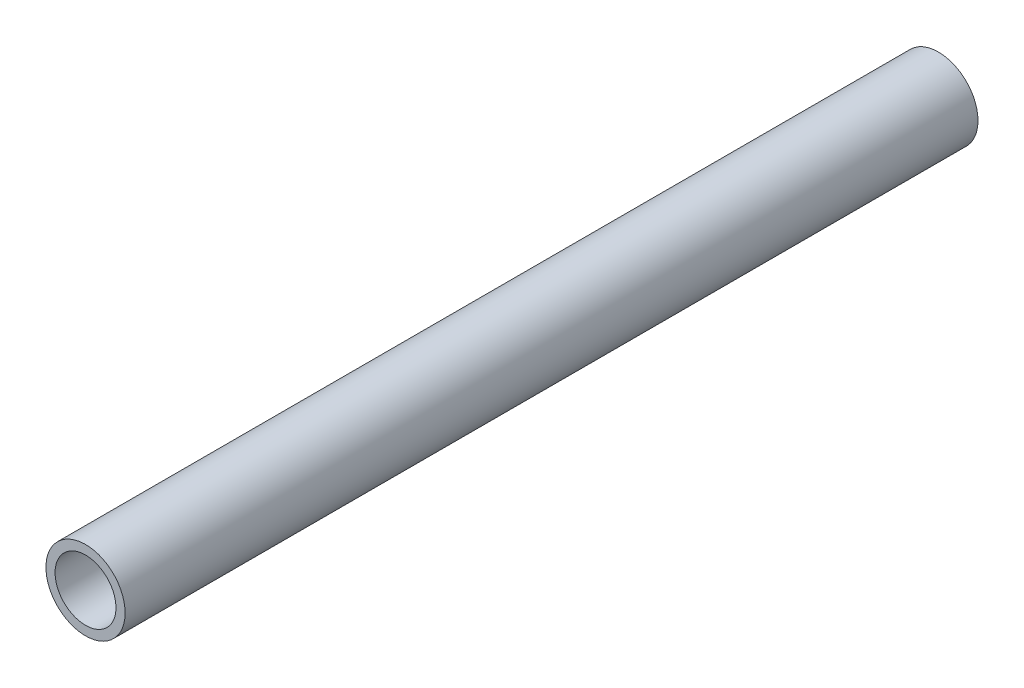
ISO-10303-21;
HEADER;
FILE_DESCRIPTION(('STEP AP214'),'2;1');
FILE_NAME('part.step','',(''),(''),'','','');
FILE_SCHEMA(('AUTOMOTIVE_DESIGN { 1 0 10303 214 1 1 1 1 }'));
ENDSEC;
DATA;
#1=APPLICATION_CONTEXT('core data for automotive mechanical design processes');
#2=APPLICATION_PROTOCOL_DEFINITION('international standard','automotive_design',2000,#1);
#3=PRODUCT_CONTEXT('',#1,'mechanical');
#4=PRODUCT('Part','Part','',(#3));
#5=PRODUCT_RELATED_PRODUCT_CATEGORY('part','',(#4));
#6=PRODUCT_DEFINITION_FORMATION('','',#4);
#7=PRODUCT_DEFINITION_CONTEXT('part definition',#1,'design');
#8=PRODUCT_DEFINITION('design','',#6,#7);
#9=PRODUCT_DEFINITION_SHAPE('','',#8);
#10=(LENGTH_UNIT() NAMED_UNIT(*) SI_UNIT(.MILLI.,.METRE.));
#11=(NAMED_UNIT(*) PLANE_ANGLE_UNIT() SI_UNIT($,.RADIAN.));
#12=(NAMED_UNIT(*) SI_UNIT($,.STERADIAN.) SOLID_ANGLE_UNIT());
#13=UNCERTAINTY_MEASURE_WITH_UNIT(LENGTH_MEASURE(1.E-05),#10,'distance_accuracy_value','');
#14=(GEOMETRIC_REPRESENTATION_CONTEXT(3) GLOBAL_UNCERTAINTY_ASSIGNED_CONTEXT((#13)) GLOBAL_UNIT_ASSIGNED_CONTEXT((#10,
#11,#12)) REPRESENTATION_CONTEXT('',''));
#15=CARTESIAN_POINT('',(0.,0.,0.));
#16=DIRECTION('',(0.,0.,1.));
#17=DIRECTION('',(1.,0.,0.));
#18=AXIS2_PLACEMENT_3D('',#15,#16,#17);
#19=CARTESIAN_POINT('',(0.,0.,355.6));
#20=DIRECTION('',(0.,0.,-1.));
#21=DIRECTION('',(-1.,0.,0.));
#22=AXIS2_PLACEMENT_3D('',#19,#20,#21);
#23=CYLINDRICAL_SURFACE('',#22,16.51);
#24=CARTESIAN_POINT('',(0.,0.,355.6));
#25=DIRECTION('',(0.,0.,1.));
#26=DIRECTION('',(1.,0.,0.));
#27=AXIS2_PLACEMENT_3D('',#24,#25,#26);
#28=CIRCLE('',#27,16.51);
#29=CARTESIAN_POINT('',(16.51,0.,355.6));
#30=VERTEX_POINT('',#29);
#31=EDGE_CURVE('E12',#30,#30,#28,.T.);
#32=ORIENTED_EDGE('',*,*,#31,.F.);
#33=EDGE_LOOP('',(#32));
#34=FACE_BOUND('',#33,.T.);
#35=CARTESIAN_POINT('',(0.,0.,0.));
#36=DIRECTION('',(0.,0.,1.));
#37=DIRECTION('',(1.,0.,0.));
#38=AXIS2_PLACEMENT_3D('',#35,#36,#37);
#39=CIRCLE('',#38,16.51);
#40=CARTESIAN_POINT('',(16.51,0.,0.));
#41=VERTEX_POINT('',#40);
#42=EDGE_CURVE('E45',#41,#41,#39,.T.);
#43=ORIENTED_EDGE('',*,*,#42,.T.);
#44=EDGE_LOOP('',(#43));
#45=FACE_BOUND('',#44,.T.);
#46=ADVANCED_FACE('F42',(#34,#45),#23,.T.);
#47=CARTESIAN_POINT('',(0.,0.,355.6));
#48=DIRECTION('',(0.,0.,1.));
#49=DIRECTION('',(1.,0.,0.));
#50=AXIS2_PLACEMENT_3D('',#47,#48,#49);
#51=PLANE('',#50);
#52=CARTESIAN_POINT('',(0.,0.,355.6));
#53=DIRECTION('',(0.,0.,-1.));
#54=DIRECTION('',(-1.,0.,0.));
#55=AXIS2_PLACEMENT_3D('',#52,#53,#54);
#56=CIRCLE('',#55,12.7);
#57=CARTESIAN_POINT('',(-12.7,0.,355.6));
#58=VERTEX_POINT('',#57);
#59=EDGE_CURVE('E52',#58,#58,#56,.T.);
#60=ORIENTED_EDGE('',*,*,#59,.T.);
#61=EDGE_LOOP('',(#60));
#62=FACE_BOUND('',#61,.T.);
#63=ORIENTED_EDGE('',*,*,#31,.T.);
#64=EDGE_LOOP('',(#63));
#65=FACE_BOUND('',#64,.T.);
#66=ADVANCED_FACE('F60',(#62,#65),#51,.T.);
#67=CARTESIAN_POINT('',(0.,0.,0.));
#68=DIRECTION('',(0.,0.,1.));
#69=DIRECTION('',(1.,0.,0.));
#70=AXIS2_PLACEMENT_3D('',#67,#68,#69);
#71=PLANE('',#70);
#72=CARTESIAN_POINT('',(0.,0.,0.));
#73=DIRECTION('',(0.,0.,-1.));
#74=DIRECTION('',(-1.,0.,0.));
#75=AXIS2_PLACEMENT_3D('',#72,#73,#74);
#76=CIRCLE('',#75,12.7);
#77=CARTESIAN_POINT('',(-12.7,0.,0.));
#78=VERTEX_POINT('',#77);
#79=EDGE_CURVE('E54',#78,#78,#76,.T.);
#80=ORIENTED_EDGE('',*,*,#79,.F.);
#81=EDGE_LOOP('',(#80));
#82=FACE_BOUND('',#81,.T.);
#83=ORIENTED_EDGE('',*,*,#42,.F.);
#84=EDGE_LOOP('',(#83));
#85=FACE_BOUND('',#84,.T.);
#86=ADVANCED_FACE('F65',(#82,#85),#71,.F.);
#87=CARTESIAN_POINT('',(0.,0.,355.6));
#88=DIRECTION('',(0.,0.,-1.));
#89=DIRECTION('',(-1.,0.,0.));
#90=AXIS2_PLACEMENT_3D('',#87,#88,#89);
#91=CYLINDRICAL_SURFACE('',#90,12.7);
#92=ORIENTED_EDGE('',*,*,#59,.F.);
#93=EDGE_LOOP('',(#92));
#94=FACE_BOUND('',#93,.T.);
#95=ORIENTED_EDGE('',*,*,#79,.T.);
#96=EDGE_LOOP('',(#95));
#97=FACE_BOUND('',#96,.T.);
#98=ADVANCED_FACE('F62',(#94,#97),#91,.F.);
#99=CLOSED_SHELL('',(#46,#66,#86,#98));
#100=MANIFOLD_SOLID_BREP('B2',#99);
#101=ADVANCED_BREP_SHAPE_REPRESENTATION('',(#18,#100),#14);
#102=SHAPE_DEFINITION_REPRESENTATION(#9,#101);
ENDSEC;
END-ISO-10303-21;
